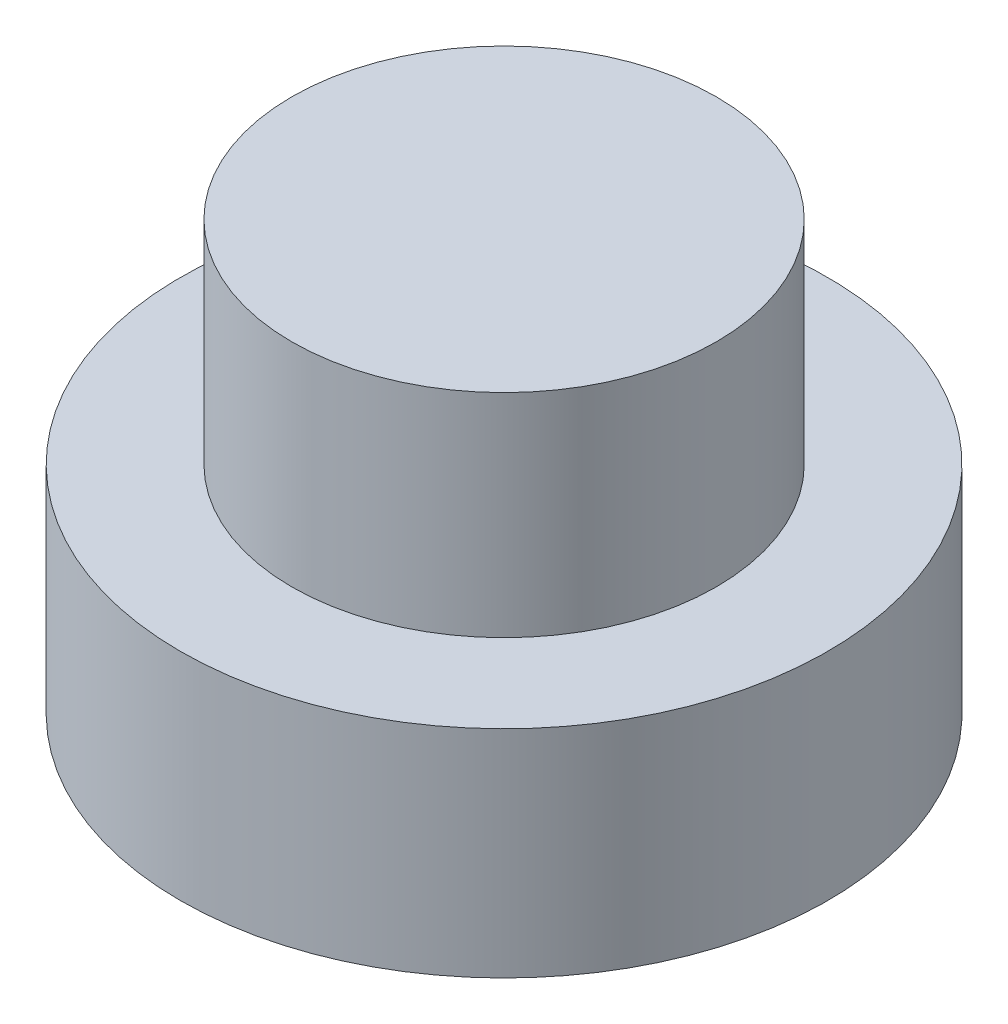
ISO-10303-21;
HEADER;
FILE_DESCRIPTION(('STEP AP214'),'2;1');
FILE_NAME('part.step','',(''),(''),'','','');
FILE_SCHEMA(('AUTOMOTIVE_DESIGN { 1 0 10303 214 1 1 1 1 }'));
ENDSEC;
DATA;
#1=APPLICATION_CONTEXT('core data for automotive mechanical design processes');
#2=APPLICATION_PROTOCOL_DEFINITION('international standard','automotive_design',2000,#1);
#3=PRODUCT_CONTEXT('',#1,'mechanical');
#4=PRODUCT('Part','Part','',(#3));
#5=PRODUCT_RELATED_PRODUCT_CATEGORY('part','',(#4));
#6=PRODUCT_DEFINITION_FORMATION('','',#4);
#7=PRODUCT_DEFINITION_CONTEXT('part definition',#1,'design');
#8=PRODUCT_DEFINITION('design','',#6,#7);
#9=PRODUCT_DEFINITION_SHAPE('','',#8);
#10=(LENGTH_UNIT() NAMED_UNIT(*) SI_UNIT(.MILLI.,.METRE.));
#11=(NAMED_UNIT(*) PLANE_ANGLE_UNIT() SI_UNIT($,.RADIAN.));
#12=(NAMED_UNIT(*) SI_UNIT($,.STERADIAN.) SOLID_ANGLE_UNIT());
#13=UNCERTAINTY_MEASURE_WITH_UNIT(LENGTH_MEASURE(1.E-05),#10,'distance_accuracy_value','');
#14=(GEOMETRIC_REPRESENTATION_CONTEXT(3) GLOBAL_UNCERTAINTY_ASSIGNED_CONTEXT((#13)) GLOBAL_UNIT_ASSIGNED_CONTEXT((#10,
#11,#12)) REPRESENTATION_CONTEXT('',''));
#15=CARTESIAN_POINT('',(0.,0.,0.));
#16=DIRECTION('',(0.,0.,1.));
#17=DIRECTION('',(1.,0.,0.));
#18=AXIS2_PLACEMENT_3D('',#15,#16,#17);
#19=CARTESIAN_POINT('',(0.,26.,0.));
#20=DIRECTION('',(0.,-1.,0.));
#21=DIRECTION('',(0.,0.,-1.));
#22=AXIS2_PLACEMENT_3D('',#19,#20,#21);
#23=CYLINDRICAL_SURFACE('',#22,5.9);
#24=CARTESIAN_POINT('',(0.,6.,0.));
#25=DIRECTION('',(0.,1.,0.));
#26=DIRECTION('',(0.,0.,1.));
#27=AXIS2_PLACEMENT_3D('',#24,#25,#26);
#28=CIRCLE('',#27,5.9);
#29=CARTESIAN_POINT('',(0.,6.,5.9));
#30=VERTEX_POINT('',#29);
#31=EDGE_CURVE('E12',#30,#30,#28,.T.);
#32=ORIENTED_EDGE('',*,*,#31,.T.);
#33=EDGE_LOOP('',(#32));
#34=FACE_BOUND('',#33,.T.);
#35=CARTESIAN_POINT('',(0.,11.9,0.));
#36=DIRECTION('',(0.,1.,0.));
#37=DIRECTION('',(0.,0.,1.));
#38=AXIS2_PLACEMENT_3D('',#35,#36,#37);
#39=CIRCLE('',#38,5.9);
#40=CARTESIAN_POINT('',(0.,11.9,5.9));
#41=VERTEX_POINT('',#40);
#42=EDGE_CURVE('E44',#41,#41,#39,.T.);
#43=ORIENTED_EDGE('',*,*,#42,.F.);
#44=EDGE_LOOP('',(#43));
#45=FACE_BOUND('',#44,.T.);
#46=ADVANCED_FACE('F40',(#34,#45),#23,.T.);
#47=CARTESIAN_POINT('',(0.,6.,0.));
#48=DIRECTION('',(0.,-1.,0.));
#49=DIRECTION('',(0.,0.,-1.));
#50=AXIS2_PLACEMENT_3D('',#47,#48,#49);
#51=CYLINDRICAL_SURFACE('',#50,9.);
#52=CARTESIAN_POINT('',(0.,6.,0.));
#53=DIRECTION('',(0.,1.,0.));
#54=DIRECTION('',(0.,0.,1.));
#55=AXIS2_PLACEMENT_3D('',#52,#53,#54);
#56=CIRCLE('',#55,9.);
#57=CARTESIAN_POINT('',(0.,6.,9.));
#58=VERTEX_POINT('',#57);
#59=EDGE_CURVE('E49',#58,#58,#56,.T.);
#60=ORIENTED_EDGE('',*,*,#59,.F.);
#61=EDGE_LOOP('',(#60));
#62=FACE_BOUND('',#61,.T.);
#63=CARTESIAN_POINT('',(0.,0.,0.));
#64=DIRECTION('',(0.,1.,0.));
#65=DIRECTION('',(0.,0.,1.));
#66=AXIS2_PLACEMENT_3D('',#63,#64,#65);
#67=CIRCLE('',#66,9.);
#68=CARTESIAN_POINT('',(0.,0.,9.));
#69=VERTEX_POINT('',#68);
#70=EDGE_CURVE('E55',#69,#69,#67,.T.);
#71=ORIENTED_EDGE('',*,*,#70,.T.);
#72=EDGE_LOOP('',(#71));
#73=FACE_BOUND('',#72,.T.);
#74=ADVANCED_FACE('F42',(#62,#73),#51,.T.);
#75=CARTESIAN_POINT('',(0.,6.,0.));
#76=DIRECTION('',(0.,1.,0.));
#77=DIRECTION('',(0.,0.,1.));
#78=AXIS2_PLACEMENT_3D('',#75,#76,#77);
#79=PLANE('',#78);
#80=ORIENTED_EDGE('',*,*,#31,.F.);
#81=EDGE_LOOP('',(#80));
#82=FACE_BOUND('',#81,.T.);
#83=ORIENTED_EDGE('',*,*,#59,.T.);
#84=EDGE_LOOP('',(#83));
#85=FACE_BOUND('',#84,.T.);
#86=ADVANCED_FACE('F72',(#82,#85),#79,.T.);
#87=CARTESIAN_POINT('',(0.,0.,0.));
#88=DIRECTION('',(0.,1.,0.));
#89=DIRECTION('',(0.,0.,1.));
#90=AXIS2_PLACEMENT_3D('',#87,#88,#89);
#91=PLANE('',#90);
#92=ORIENTED_EDGE('',*,*,#70,.F.);
#93=EDGE_LOOP('',(#92));
#94=FACE_BOUND('',#93,.T.);
#95=ADVANCED_FACE('F77',(#94),#91,.F.);
#96=CARTESIAN_POINT('',(0.,11.9,0.));
#97=DIRECTION('',(0.,1.,0.));
#98=DIRECTION('',(0.,0.,1.));
#99=AXIS2_PLACEMENT_3D('',#96,#97,#98);
#100=PLANE('',#99);
#101=ORIENTED_EDGE('',*,*,#42,.T.);
#102=EDGE_LOOP('',(#101));
#103=FACE_BOUND('',#102,.T.);
#104=ADVANCED_FACE('F65',(#103),#100,.T.);
#105=CLOSED_SHELL('',(#46,#74,#86,#95,#104));
#106=MANIFOLD_SOLID_BREP('B2',#105);
#107=ADVANCED_BREP_SHAPE_REPRESENTATION('',(#18,#106),#14);
#108=SHAPE_DEFINITION_REPRESENTATION(#9,#107);
ENDSEC;
END-ISO-10303-21;
